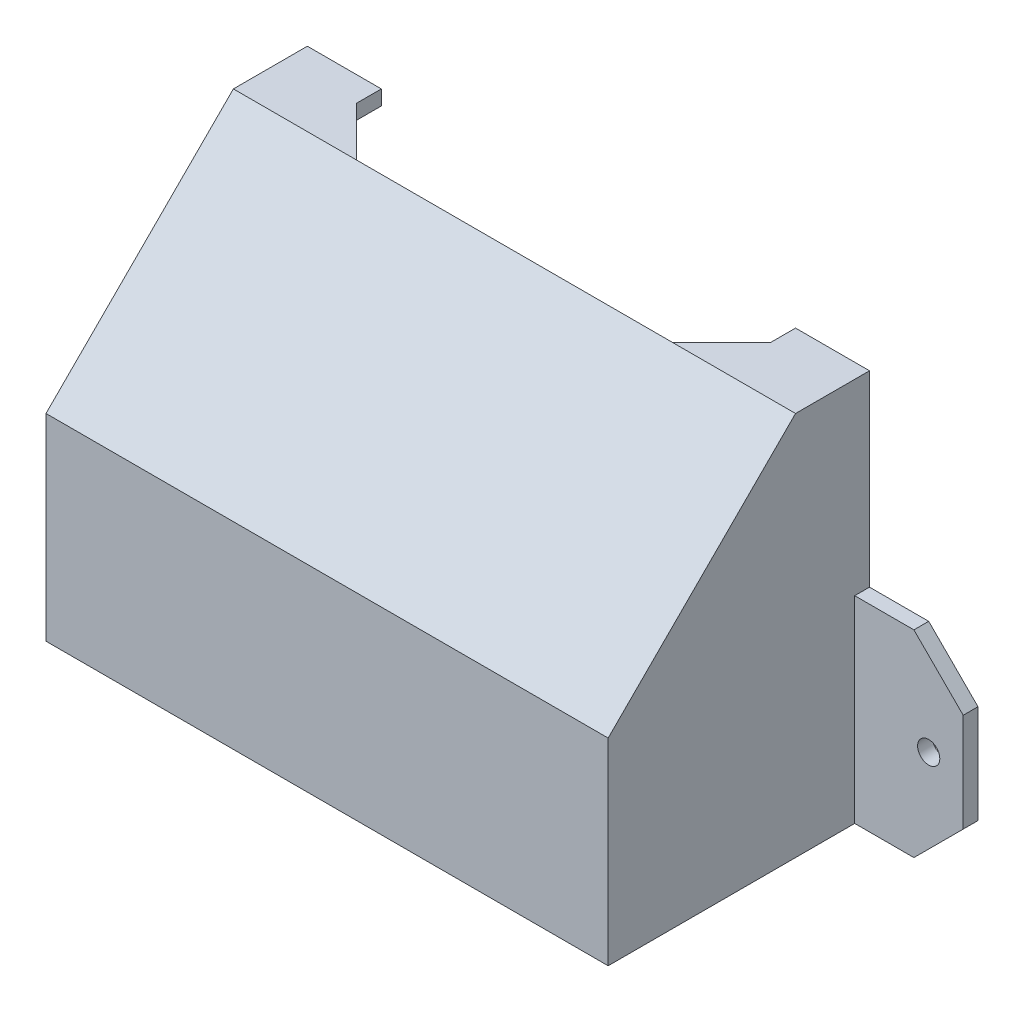
ISO-10303-21;
HEADER;
FILE_DESCRIPTION(('STEP AP214'),'2;1');
FILE_NAME('part.step','',(''),(''),'','','');
FILE_SCHEMA(('AUTOMOTIVE_DESIGN { 1 0 10303 214 1 1 1 1 }'));
ENDSEC;
DATA;
#1=APPLICATION_CONTEXT('core data for automotive mechanical design processes');
#2=APPLICATION_PROTOCOL_DEFINITION('international standard','automotive_design',2000,#1);
#3=PRODUCT_CONTEXT('',#1,'mechanical');
#4=PRODUCT('Part','Part','',(#3));
#5=PRODUCT_RELATED_PRODUCT_CATEGORY('part','',(#4));
#6=PRODUCT_DEFINITION_FORMATION('','',#4);
#7=PRODUCT_DEFINITION_CONTEXT('part definition',#1,'design');
#8=PRODUCT_DEFINITION('design','',#6,#7);
#9=PRODUCT_DEFINITION_SHAPE('','',#8);
#10=(LENGTH_UNIT() NAMED_UNIT(*) SI_UNIT(.MILLI.,.METRE.));
#11=(NAMED_UNIT(*) PLANE_ANGLE_UNIT() SI_UNIT($,.RADIAN.));
#12=(NAMED_UNIT(*) SI_UNIT($,.STERADIAN.) SOLID_ANGLE_UNIT());
#13=UNCERTAINTY_MEASURE_WITH_UNIT(LENGTH_MEASURE(1.E-05),#10,'distance_accuracy_value','');
#14=(GEOMETRIC_REPRESENTATION_CONTEXT(3) GLOBAL_UNCERTAINTY_ASSIGNED_CONTEXT((#13)) GLOBAL_UNIT_ASSIGNED_CONTEXT((#10,
#11,#12)) REPRESENTATION_CONTEXT('',''));
#15=CARTESIAN_POINT('',(0.,0.,0.));
#16=DIRECTION('',(0.,0.,1.));
#17=DIRECTION('',(1.,0.,0.));
#18=AXIS2_PLACEMENT_3D('',#15,#16,#17);
#19=CARTESIAN_POINT('',(57.0000000000004,40.,0.));
#20=DIRECTION('',(0.,0.,1.));
#21=DIRECTION('',(1.,0.,0.));
#22=AXIS2_PLACEMENT_3D('',#19,#20,#21);
#23=PLANE('',#22);
#24=CARTESIAN_POINT('',(72.,19.9999999999999,0.));
#25=DIRECTION('',(0.,0.,-1.));
#26=DIRECTION('',(-1.,0.,0.));
#27=AXIS2_PLACEMENT_3D('',#24,#25,#26);
#28=CIRCLE('',#27,2.25);
#29=CARTESIAN_POINT('',(69.75,19.9999999999999,0.));
#30=VERTEX_POINT('',#29);
#31=EDGE_CURVE('E756',#30,#30,#28,.T.);
#32=ORIENTED_EDGE('',*,*,#31,.F.);
#33=EDGE_LOOP('',(#32));
#34=FACE_BOUND('',#33,.T.);
#35=DIRECTION('',(0.,-1.,0.));
#36=VECTOR('',#35,1.);
#37=CARTESIAN_POINT('',(79.0000000000001,40.,0.));
#38=LINE('',#37,#36);
#39=CARTESIAN_POINT('',(79.0000000000001,29.9999999999999,0.));
#40=VERTEX_POINT('',#39);
#41=CARTESIAN_POINT('',(79.0000000000001,9.99999999999998,0.));
#42=VERTEX_POINT('',#41);
#43=EDGE_CURVE('E344',#40,#42,#38,.T.);
#44=ORIENTED_EDGE('',*,*,#43,.T.);
#45=DIRECTION('',(-0.70710678118655,-0.707106781186546,0.));
#46=VECTOR('',#45,1.);
#47=CARTESIAN_POINT('',(79.0000000000001,9.99999999999998,0.));
#48=LINE('',#47,#46);
#49=CARTESIAN_POINT('',(69.,0.,0.));
#50=VERTEX_POINT('',#49);
#51=EDGE_CURVE('E265',#42,#50,#48,.T.);
#52=ORIENTED_EDGE('',*,*,#51,.T.);
#53=DIRECTION('',(-1.,0.,0.));
#54=VECTOR('',#53,1.);
#55=CARTESIAN_POINT('',(57.0000000000004,0.,0.));
#56=LINE('',#55,#54);
#57=CARTESIAN_POINT('',(54.0000000000003,0.,0.));
#58=VERTEX_POINT('',#57);
#59=EDGE_CURVE('E322',#50,#58,#56,.T.);
#60=ORIENTED_EDGE('',*,*,#59,.T.);
#61=DIRECTION('',(0.,-1.,0.));
#62=VECTOR('',#61,1.);
#63=CARTESIAN_POINT('',(54.0000000000003,40.,0.));
#64=LINE('',#63,#62);
#65=CARTESIAN_POINT('',(54.0000000000003,74.9999999999996,0.));
#66=VERTEX_POINT('',#65);
#67=EDGE_CURVE('E341',#66,#58,#64,.T.);
#68=ORIENTED_EDGE('',*,*,#67,.F.);
#69=DIRECTION('',(1.,0.,0.));
#70=VECTOR('',#69,1.);
#71=CARTESIAN_POINT('',(-500000.,74.9999999999996,-3.26163235309096E-09));
#72=LINE('',#71,#70);
#73=CARTESIAN_POINT('',(41.9999999998595,74.9999999999996,0.));
#74=VERTEX_POINT('',#73);
#75=EDGE_CURVE('E223',#74,#66,#72,.T.);
#76=ORIENTED_EDGE('',*,*,#75,.F.);
#77=DIRECTION('',(0.,-1.,0.));
#78=VECTOR('',#77,1.);
#79=CARTESIAN_POINT('',(42.,311.753396714048,0.));
#80=LINE('',#79,#78);
#81=CARTESIAN_POINT('',(42.,77.9999999999996,0.));
#82=VERTEX_POINT('',#81);
#83=EDGE_CURVE('E464',#82,#74,#80,.T.);
#84=ORIENTED_EDGE('',*,*,#83,.F.);
#85=DIRECTION('',(-1.,0.,0.));
#86=VECTOR('',#85,1.);
#87=CARTESIAN_POINT('',(-54.,77.9999999999996,0.));
#88=LINE('',#87,#86);
#89=CARTESIAN_POINT('',(57.,77.9999999999996,0.));
#90=VERTEX_POINT('',#89);
#91=EDGE_CURVE('E312',#90,#82,#88,.T.);
#92=ORIENTED_EDGE('',*,*,#91,.F.);
#93=DIRECTION('',(0.,-1.,0.));
#94=VECTOR('',#93,1.);
#95=CARTESIAN_POINT('',(57.,77.9999999999996,0.));
#96=LINE('',#95,#94);
#97=CARTESIAN_POINT('',(57.,40.,0.));
#98=VERTEX_POINT('',#97);
#99=EDGE_CURVE('E387',#90,#98,#96,.T.);
#100=ORIENTED_EDGE('',*,*,#99,.T.);
#101=DIRECTION('',(-1.,0.,0.));
#102=VECTOR('',#101,1.);
#103=CARTESIAN_POINT('',(57.0000000000004,40.,0.));
#104=LINE('',#103,#102);
#105=CARTESIAN_POINT('',(69.,40.,0.));
#106=VERTEX_POINT('',#105);
#107=EDGE_CURVE('E337',#106,#98,#104,.T.);
#108=ORIENTED_EDGE('',*,*,#107,.F.);
#109=DIRECTION('',(-0.707106781186546,0.707106781186549,0.));
#110=VECTOR('',#109,1.);
#111=CARTESIAN_POINT('',(69.,40.,0.));
#112=LINE('',#111,#110);
#113=EDGE_CURVE('E263',#106,#40,#112,.F.);
#114=ORIENTED_EDGE('',*,*,#113,.T.);
#115=EDGE_LOOP('',(#44,#52,#60,#68,#76,#84,#92,#100,#108,#114));
#116=FACE_BOUND('',#115,.T.);
#117=ADVANCED_FACE('F33',(#34,#116),#23,.F.);
#118=CARTESIAN_POINT('',(-72.,19.9999999999999,0.));
#119=DIRECTION('',(0.,0.,1.));
#120=DIRECTION('',(1.,0.,0.));
#121=AXIS2_PLACEMENT_3D('',#118,#119,#120);
#122=CIRCLE('',#121,2.25);
#123=CARTESIAN_POINT('',(-69.75,19.9999999999999,0.));
#124=VERTEX_POINT('',#123);
#125=EDGE_CURVE('E235',#124,#124,#122,.T.);
#126=ORIENTED_EDGE('',*,*,#125,.T.);
#127=EDGE_LOOP('',(#126));
#128=FACE_BOUND('',#127,.T.);
#129=DIRECTION('',(-1.,0.,0.));
#130=VECTOR('',#129,1.);
#131=CARTESIAN_POINT('',(-57.0000000000004,0.,0.));
#132=LINE('',#131,#130);
#133=CARTESIAN_POINT('',(-54.0000000000003,0.,0.));
#134=VERTEX_POINT('',#133);
#135=CARTESIAN_POINT('',(-69.,0.,0.));
#136=VERTEX_POINT('',#135);
#137=EDGE_CURVE('E288',#134,#136,#132,.T.);
#138=ORIENTED_EDGE('',*,*,#137,.T.);
#139=DIRECTION('',(-0.70710678118655,0.707106781186546,0.));
#140=VECTOR('',#139,1.);
#141=CARTESIAN_POINT('',(-79.,9.99999999999998,0.));
#142=LINE('',#141,#140);
#143=CARTESIAN_POINT('',(-79.,9.99999999999998,0.));
#144=VERTEX_POINT('',#143);
#145=EDGE_CURVE('E41',#136,#144,#142,.T.);
#146=ORIENTED_EDGE('',*,*,#145,.T.);
#147=DIRECTION('',(0.,-1.,0.));
#148=VECTOR('',#147,1.);
#149=CARTESIAN_POINT('',(-79.,40.,0.));
#150=LINE('',#149,#148);
#151=CARTESIAN_POINT('',(-79.,29.9999999999999,0.));
#152=VERTEX_POINT('',#151);
#153=EDGE_CURVE('E241',#152,#144,#150,.T.);
#154=ORIENTED_EDGE('',*,*,#153,.F.);
#155=DIRECTION('',(-0.707106781186546,-0.707106781186549,0.));
#156=VECTOR('',#155,1.);
#157=CARTESIAN_POINT('',(-69.,40.,0.));
#158=LINE('',#157,#156);
#159=CARTESIAN_POINT('',(-69.,40.,0.));
#160=VERTEX_POINT('',#159);
#161=EDGE_CURVE('E48',#152,#160,#158,.F.);
#162=ORIENTED_EDGE('',*,*,#161,.T.);
#163=DIRECTION('',(-1.,0.,0.));
#164=VECTOR('',#163,1.);
#165=CARTESIAN_POINT('',(-57.0000000000004,40.,0.));
#166=LINE('',#165,#164);
#167=CARTESIAN_POINT('',(-57.,40.,0.));
#168=VERTEX_POINT('',#167);
#169=EDGE_CURVE('E333',#168,#160,#166,.T.);
#170=ORIENTED_EDGE('',*,*,#169,.F.);
#171=DIRECTION('',(0.,-1.,0.));
#172=VECTOR('',#171,1.);
#173=CARTESIAN_POINT('',(-57.,77.9999999999996,0.));
#174=LINE('',#173,#172);
#175=CARTESIAN_POINT('',(-57.,77.9999999999996,0.));
#176=VERTEX_POINT('',#175);
#177=EDGE_CURVE('E415',#176,#168,#174,.T.);
#178=ORIENTED_EDGE('',*,*,#177,.F.);
#179=CARTESIAN_POINT('',(-42.,77.9999999999996,0.));
#180=VERTEX_POINT('',#179);
#181=EDGE_CURVE('E231',#180,#176,#88,.T.);
#182=ORIENTED_EDGE('',*,*,#181,.F.);
#183=DIRECTION('',(0.,-1.,0.));
#184=VECTOR('',#183,1.);
#185=CARTESIAN_POINT('',(-42.,311.753396714048,0.));
#186=LINE('',#185,#184);
#187=CARTESIAN_POINT('',(-42.,74.9999999999996,0.));
#188=VERTEX_POINT('',#187);
#189=EDGE_CURVE('E227',#180,#188,#186,.T.);
#190=ORIENTED_EDGE('',*,*,#189,.T.);
#191=CARTESIAN_POINT('',(-54.0000000000003,74.9999999999996,0.));
#192=VERTEX_POINT('',#191);
#193=EDGE_CURVE('E214',#192,#188,#72,.T.);
#194=ORIENTED_EDGE('',*,*,#193,.F.);
#195=DIRECTION('',(0.,-1.,0.));
#196=VECTOR('',#195,1.);
#197=CARTESIAN_POINT('',(-54.0000000000003,40.,0.));
#198=LINE('',#197,#196);
#199=EDGE_CURVE('E334',#192,#134,#198,.T.);
#200=ORIENTED_EDGE('',*,*,#199,.T.);
#201=EDGE_LOOP('',(#138,#146,#154,#162,#170,#178,#182,#190,#194,#200));
#202=FACE_BOUND('',#201,.T.);
#203=ADVANCED_FACE('F229',(#128,#202),#23,.F.);
#204=CARTESIAN_POINT('',(-54.,77.9999999999996,15.));
#205=DIRECTION('',(0.,1.,0.));
#206=DIRECTION('',(0.,0.,1.));
#207=AXIS2_PLACEMENT_3D('',#204,#205,#206);
#208=PLANE('',#207);
#209=ORIENTED_EDGE('',*,*,#91,.T.);
#210=DIRECTION('',(0.,0.,-1.));
#211=VECTOR('',#210,1.);
#212=CARTESIAN_POINT('',(42.,77.9999999999996,4.99999999999999));
#213=LINE('',#212,#211);
#214=CARTESIAN_POINT('',(42.,77.9999999999996,4.99999999999998));
#215=VERTEX_POINT('',#214);
#216=EDGE_CURVE('E439',#215,#82,#213,.T.);
#217=ORIENTED_EDGE('',*,*,#216,.F.);
#218=DIRECTION('',(0.707106781186548,0.,-0.707106781186548));
#219=VECTOR('',#218,1.);
#220=CARTESIAN_POINT('',(32.,77.9999999999996,15.));
#221=LINE('',#220,#219);
#222=CARTESIAN_POINT('',(32.,77.9999999999996,15.));
#223=VERTEX_POINT('',#222);
#224=EDGE_CURVE('E438',#223,#215,#221,.T.);
#225=ORIENTED_EDGE('',*,*,#224,.F.);
#226=DIRECTION('',(-1.,0.,0.));
#227=VECTOR('',#226,1.);
#228=CARTESIAN_POINT('',(-54.,77.9999999999996,15.));
#229=LINE('',#228,#227);
#230=CARTESIAN_POINT('',(57.,77.9999999999996,15.));
#231=VERTEX_POINT('',#230);
#232=EDGE_CURVE('E418',#231,#223,#229,.T.);
#233=ORIENTED_EDGE('',*,*,#232,.F.);
#234=DIRECTION('',(0.,0.,-1.));
#235=VECTOR('',#234,1.);
#236=CARTESIAN_POINT('',(57.,77.9999999999996,15.));
#237=LINE('',#236,#235);
#238=EDGE_CURVE('E392',#231,#90,#237,.T.);
#239=ORIENTED_EDGE('',*,*,#238,.T.);
#240=EDGE_LOOP('',(#209,#217,#225,#233,#239));
#241=FACE_BOUND('',#240,.T.);
#242=ADVANCED_FACE('F435',(#241),#208,.T.);
#243=CARTESIAN_POINT('',(-32.,77.9999999999996,15.));
#244=VERTEX_POINT('',#243);
#245=CARTESIAN_POINT('',(-57.,77.9999999999996,15.));
#246=VERTEX_POINT('',#245);
#247=EDGE_CURVE('E417',#244,#246,#229,.T.);
#248=ORIENTED_EDGE('',*,*,#247,.F.);
#249=DIRECTION('',(0.707106781186548,0.,0.707106781186547));
#250=VECTOR('',#249,1.);
#251=CARTESIAN_POINT('',(-42.,77.9999999999996,5.));
#252=LINE('',#251,#250);
#253=CARTESIAN_POINT('',(-42.,77.9999999999996,5.));
#254=VERTEX_POINT('',#253);
#255=EDGE_CURVE('E445',#254,#244,#252,.T.);
#256=ORIENTED_EDGE('',*,*,#255,.F.);
#257=DIRECTION('',(0.,0.,1.));
#258=VECTOR('',#257,1.);
#259=CARTESIAN_POINT('',(-42.,77.9999999999996,0.));
#260=LINE('',#259,#258);
#261=EDGE_CURVE('E454',#180,#254,#260,.T.);
#262=ORIENTED_EDGE('',*,*,#261,.F.);
#263=ORIENTED_EDGE('',*,*,#181,.T.);
#264=DIRECTION('',(0.,0.,-1.));
#265=VECTOR('',#264,1.);
#266=CARTESIAN_POINT('',(-57.,77.9999999999996,15.));
#267=LINE('',#266,#265);
#268=EDGE_CURVE('E412',#246,#176,#267,.T.);
#269=ORIENTED_EDGE('',*,*,#268,.F.);
#270=EDGE_LOOP('',(#248,#256,#262,#263,#269));
#271=FACE_BOUND('',#270,.T.);
#272=ADVANCED_FACE('F428',(#271),#208,.T.);
#273=CARTESIAN_POINT('',(-500000.,75.8786796564399,12.8786796531787));
#274=DIRECTION('',(0.,0.707106781186552,0.707106781186543));
#275=DIRECTION('',(0.,-0.707106781186543,0.707106781186552));
#276=AXIS2_PLACEMENT_3D('',#273,#274,#275);
#277=PLANE('',#276);
#278=DIRECTION('',(-0.577350269189627,-0.577350269189623,0.577350269189627));
#279=VECTOR('',#278,1.);
#280=CARTESIAN_POINT('',(-166643.919119771,-166602.161760457,166690.919119771));
#281=LINE('',#280,#279);
#282=CARTESIAN_POINT('',(33.2426406870354,74.9999999999996,13.7573593128927));
#283=VERTEX_POINT('',#282);
#284=CARTESIAN_POINT('',(32.0000000000391,73.7573593128802,15.));
#285=VERTEX_POINT('',#284);
#286=EDGE_CURVE('E470',#283,#285,#281,.T.);
#287=ORIENTED_EDGE('',*,*,#286,.F.);
#288=DIRECTION('',(1.,0.,0.));
#289=VECTOR('',#288,1.);
#290=CARTESIAN_POINT('',(-500000.,74.9999999999996,13.7573593096191));
#291=LINE('',#290,#289);
#292=CARTESIAN_POINT('',(54.0000000000002,74.9999999999996,13.7573593128807));
#293=VERTEX_POINT('',#292);
#294=EDGE_CURVE('E222',#283,#293,#291,.T.);
#295=ORIENTED_EDGE('',*,*,#294,.T.);
#296=DIRECTION('',(0.,-0.707106781186543,0.707106781186552));
#297=VECTOR('',#296,1.);
#298=CARTESIAN_POINT('',(54.0000000000002,75.8786796564399,12.8786796564404));
#299=LINE('',#298,#297);
#300=CARTESIAN_POINT('',(54.,38.7573593128807,50.));
#301=VERTEX_POINT('',#300);
#302=EDGE_CURVE('E396',#293,#301,#299,.T.);
#303=ORIENTED_EDGE('',*,*,#302,.T.);
#304=DIRECTION('',(1.,0.,0.));
#305=VECTOR('',#304,1.);
#306=CARTESIAN_POINT('',(-500000.,38.757359309844,49.9999999997752));
#307=LINE('',#306,#305);
#308=CARTESIAN_POINT('',(-54.,38.7573593128801,50.));
#309=VERTEX_POINT('',#308);
#310=EDGE_CURVE('E478',#309,#301,#307,.T.);
#311=ORIENTED_EDGE('',*,*,#310,.F.);
#312=DIRECTION('',(0.,-0.707106781186543,0.707106781186552));
#313=VECTOR('',#312,1.);
#314=CARTESIAN_POINT('',(-53.9999999999736,75.8786796594927,12.8786796533869));
#315=LINE('',#314,#313);
#316=CARTESIAN_POINT('',(-54.0000000000002,74.9999999999996,13.7573593128807));
#317=VERTEX_POINT('',#316);
#318=EDGE_CURVE('E479',#317,#309,#315,.T.);
#319=ORIENTED_EDGE('',*,*,#318,.F.);
#320=CARTESIAN_POINT('',(-33.2426406870781,74.9999999999996,13.7573593129209));
#321=VERTEX_POINT('',#320);
#322=EDGE_CURVE('E474',#317,#321,#291,.T.);
#323=ORIENTED_EDGE('',*,*,#322,.T.);
#324=DIRECTION('',(-0.57735026918963,0.577350269189618,-0.57735026918963));
#325=VECTOR('',#324,1.);
#326=CARTESIAN_POINT('',(-166689.414213566,166731.171572875,-166642.414213566));
#327=LINE('',#326,#325);
#328=CARTESIAN_POINT('',(-32.0000000000107,73.7573593128502,15.0000000000148));
#329=VERTEX_POINT('',#328);
#330=EDGE_CURVE('E455',#329,#321,#327,.T.);
#331=ORIENTED_EDGE('',*,*,#330,.F.);
#332=DIRECTION('',(-1.,0.,0.));
#333=VECTOR('',#332,1.);
#334=CARTESIAN_POINT('',(-500000.,73.7573593095645,15.0000000000542));
#335=LINE('',#334,#333);
#336=EDGE_CURVE('E255',#285,#329,#335,.T.);
#337=ORIENTED_EDGE('',*,*,#336,.F.);
#338=EDGE_LOOP('',(#287,#295,#303,#311,#319,#323,#331,#337));
#339=FACE_BOUND('',#338,.T.);
#340=ADVANCED_FACE('F486',(#339),#277,.F.);
#341=CARTESIAN_POINT('',(-500000.,74.9999999999996,-3.26163235309096E-09));
#342=DIRECTION('',(0.,1.,0.));
#343=DIRECTION('',(0.,0.,1.));
#344=AXIS2_PLACEMENT_3D('',#341,#342,#343);
#345=PLANE('',#344);
#346=DIRECTION('',(0.,0.,1.));
#347=VECTOR('',#346,1.);
#348=CARTESIAN_POINT('',(41.9999999999732,74.9999999999996,-3.26163235309096E-09));
#349=LINE('',#348,#347);
#350=CARTESIAN_POINT('',(42.0000000000016,74.9999999999996,4.99999999999545));
#351=VERTEX_POINT('',#350);
#352=EDGE_CURVE('E252',#74,#351,#349,.T.);
#353=ORIENTED_EDGE('',*,*,#352,.F.);
#354=ORIENTED_EDGE('',*,*,#75,.T.);
#355=DIRECTION('',(0.,0.,1.));
#356=VECTOR('',#355,1.);
#357=CARTESIAN_POINT('',(54.0000000000003,74.9999999999996,0.));
#358=LINE('',#357,#356);
#359=EDGE_CURVE('E399',#66,#293,#358,.T.);
#360=ORIENTED_EDGE('',*,*,#359,.T.);
#361=ORIENTED_EDGE('',*,*,#294,.F.);
#362=DIRECTION('',(-0.707106781186548,0.,0.707106781186548));
#363=VECTOR('',#362,1.);
#364=CARTESIAN_POINT('',(-249976.499999998,74.9999999999996,250023.499999998));
#365=LINE('',#364,#363);
#366=EDGE_CURVE('E243',#351,#283,#365,.T.);
#367=ORIENTED_EDGE('',*,*,#366,.F.);
#368=EDGE_LOOP('',(#353,#354,#360,#361,#367));
#369=FACE_BOUND('',#368,.T.);
#370=ADVANCED_FACE('F496',(#369),#345,.F.);
#371=DIRECTION('',(-0.707106781186548,0.,-0.707106781186547));
#372=VECTOR('',#371,1.);
#373=CARTESIAN_POINT('',(-250023.500000002,74.9999999999996,-249976.500000002));
#374=LINE('',#373,#372);
#375=CARTESIAN_POINT('',(-41.9999999999732,74.9999999999996,5.));
#376=VERTEX_POINT('',#375);
#377=EDGE_CURVE('E240',#321,#376,#374,.T.);
#378=ORIENTED_EDGE('',*,*,#377,.F.);
#379=ORIENTED_EDGE('',*,*,#322,.F.);
#380=DIRECTION('',(0.,0.,1.));
#381=VECTOR('',#380,1.);
#382=CARTESIAN_POINT('',(-53.9999999999736,74.9999999999996,-6.10627159947086E-09));
#383=LINE('',#382,#381);
#384=EDGE_CURVE('E221',#192,#317,#383,.T.);
#385=ORIENTED_EDGE('',*,*,#384,.F.);
#386=ORIENTED_EDGE('',*,*,#193,.T.);
#387=DIRECTION('',(0.,0.,-1.));
#388=VECTOR('',#387,1.);
#389=CARTESIAN_POINT('',(-41.9999999999732,74.9999999999996,-3.26163235309096E-09));
#390=LINE('',#389,#388);
#391=EDGE_CURVE('E218',#376,#188,#390,.T.);
#392=ORIENTED_EDGE('',*,*,#391,.F.);
#393=EDGE_LOOP('',(#378,#379,#385,#386,#392));
#394=FACE_BOUND('',#393,.T.);
#395=ADVANCED_FACE('F216',(#394),#345,.F.);
#396=CARTESIAN_POINT('',(54.0000000000003,40.,0.));
#397=DIRECTION('',(1.,0.,0.));
#398=DIRECTION('',(0.,0.,-1.));
#399=AXIS2_PLACEMENT_3D('',#396,#397,#398);
#400=PLANE('',#399);
#401=ORIENTED_EDGE('',*,*,#302,.F.);
#402=ORIENTED_EDGE('',*,*,#359,.F.);
#403=ORIENTED_EDGE('',*,*,#67,.T.);
#404=DIRECTION('',(0.,0.,1.));
#405=VECTOR('',#404,1.);
#406=CARTESIAN_POINT('',(54.0000000000003,0.,0.));
#407=LINE('',#406,#405);
#408=CARTESIAN_POINT('',(54.,0.,50.));
#409=VERTEX_POINT('',#408);
#410=EDGE_CURVE('E324',#58,#409,#407,.T.);
#411=ORIENTED_EDGE('',*,*,#410,.T.);
#412=DIRECTION('',(0.,-1.,0.));
#413=VECTOR('',#412,1.);
#414=CARTESIAN_POINT('',(54.,40.,50.));
#415=LINE('',#414,#413);
#416=EDGE_CURVE('E339',#301,#409,#415,.T.);
#417=ORIENTED_EDGE('',*,*,#416,.F.);
#418=EDGE_LOOP('',(#401,#402,#403,#411,#417));
#419=FACE_BOUND('',#418,.T.);
#420=ADVANCED_FACE('F501',(#419),#400,.F.);
#421=CARTESIAN_POINT('',(-54.,40.,50.));
#422=DIRECTION('',(0.,0.,1.));
#423=DIRECTION('',(1.,0.,0.));
#424=AXIS2_PLACEMENT_3D('',#421,#422,#423);
#425=PLANE('',#424);
#426=ORIENTED_EDGE('',*,*,#310,.T.);
#427=ORIENTED_EDGE('',*,*,#416,.T.);
#428=DIRECTION('',(-1.,0.,0.));
#429=VECTOR('',#428,1.);
#430=CARTESIAN_POINT('',(-54.,0.,50.));
#431=LINE('',#430,#429);
#432=CARTESIAN_POINT('',(-54.,0.,50.));
#433=VERTEX_POINT('',#432);
#434=EDGE_CURVE('E327',#409,#433,#431,.T.);
#435=ORIENTED_EDGE('',*,*,#434,.T.);
#436=DIRECTION('',(0.,-1.,0.));
#437=VECTOR('',#436,1.);
#438=CARTESIAN_POINT('',(-54.,40.,50.));
#439=LINE('',#438,#437);
#440=EDGE_CURVE('E336',#309,#433,#439,.T.);
#441=ORIENTED_EDGE('',*,*,#440,.F.);
#442=EDGE_LOOP('',(#426,#427,#435,#441));
#443=FACE_BOUND('',#442,.T.);
#444=ADVANCED_FACE('F569',(#443),#425,.F.);
#445=CARTESIAN_POINT('',(-54.0000000000003,40.,0.));
#446=DIRECTION('',(-1.,0.,0.));
#447=DIRECTION('',(0.,0.,1.));
#448=AXIS2_PLACEMENT_3D('',#445,#446,#447);
#449=PLANE('',#448);
#450=ORIENTED_EDGE('',*,*,#318,.T.);
#451=ORIENTED_EDGE('',*,*,#440,.T.);
#452=DIRECTION('',(0.,0.,-1.));
#453=VECTOR('',#452,1.);
#454=CARTESIAN_POINT('',(-54.0000000000003,0.,0.));
#455=LINE('',#454,#453);
#456=EDGE_CURVE('E330',#433,#134,#455,.T.);
#457=ORIENTED_EDGE('',*,*,#456,.T.);
#458=ORIENTED_EDGE('',*,*,#199,.F.);
#459=ORIENTED_EDGE('',*,*,#384,.T.);
#460=EDGE_LOOP('',(#450,#451,#457,#458,#459));
#461=FACE_BOUND('',#460,.T.);
#462=ADVANCED_FACE('F483',(#461),#449,.F.);
#463=CARTESIAN_POINT('',(0.,40.,0.));
#464=DIRECTION('',(0.,-1.,0.));
#465=DIRECTION('',(0.,0.,-1.));
#466=AXIS2_PLACEMENT_3D('',#463,#464,#465);
#467=PLANE('',#466);
#468=DIRECTION('',(1.,0.,0.));
#469=VECTOR('',#468,1.);
#470=CARTESIAN_POINT('',(79.0000000000001,40.,3.00000000000007));
#471=LINE('',#470,#469);
#472=CARTESIAN_POINT('',(57.0000000000001,40.,3.00000000000006));
#473=VERTEX_POINT('',#472);
#474=CARTESIAN_POINT('',(69.,40.,3.00000000000007));
#475=VERTEX_POINT('',#474);
#476=EDGE_CURVE('E371',#473,#475,#471,.T.);
#477=ORIENTED_EDGE('',*,*,#476,.T.);
#478=DIRECTION('',(0.,0.,-1.));
#479=VECTOR('',#478,1.);
#480=CARTESIAN_POINT('',(69.,40.,0.));
#481=LINE('',#480,#479);
#482=EDGE_CURVE('E275',#475,#106,#481,.T.);
#483=ORIENTED_EDGE('',*,*,#482,.T.);
#484=ORIENTED_EDGE('',*,*,#107,.T.);
#485=DIRECTION('',(0.,0.,1.));
#486=VECTOR('',#485,1.);
#487=CARTESIAN_POINT('',(57.,40.,0.));
#488=LINE('',#487,#486);
#489=EDGE_CURVE('E382',#98,#473,#488,.T.);
#490=ORIENTED_EDGE('',*,*,#489,.T.);
#491=EDGE_LOOP('',(#477,#483,#484,#490));
#492=FACE_BOUND('',#491,.T.);
#493=ADVANCED_FACE('F380',(#492),#467,.F.);
#494=ORIENTED_EDGE('',*,*,#169,.T.);
#495=DIRECTION('',(0.,0.,1.));
#496=VECTOR('',#495,1.);
#497=CARTESIAN_POINT('',(-69.,40.,0.));
#498=LINE('',#497,#496);
#499=CARTESIAN_POINT('',(-69.,40.,3.));
#500=VERTEX_POINT('',#499);
#501=EDGE_CURVE('E11',#160,#500,#498,.T.);
#502=ORIENTED_EDGE('',*,*,#501,.T.);
#503=DIRECTION('',(1.,0.,0.));
#504=VECTOR('',#503,1.);
#505=CARTESIAN_POINT('',(-79.,40.,3.));
#506=LINE('',#505,#504);
#507=CARTESIAN_POINT('',(-57.,40.,3.));
#508=VERTEX_POINT('',#507);
#509=EDGE_CURVE('E367',#500,#508,#506,.T.);
#510=ORIENTED_EDGE('',*,*,#509,.T.);
#511=DIRECTION('',(0.,0.,1.));
#512=VECTOR('',#511,1.);
#513=CARTESIAN_POINT('',(-57.,40.,0.));
#514=LINE('',#513,#512);
#515=EDGE_CURVE('E365',#168,#508,#514,.T.);
#516=ORIENTED_EDGE('',*,*,#515,.F.);
#517=EDGE_LOOP('',(#494,#502,#510,#516));
#518=FACE_BOUND('',#517,.T.);
#519=ADVANCED_FACE('F555',(#518),#467,.F.);
#520=CARTESIAN_POINT('',(-79.,40.,0.));
#521=DIRECTION('',(1.,0.,0.));
#522=DIRECTION('',(0.,0.,-1.));
#523=AXIS2_PLACEMENT_3D('',#520,#521,#522);
#524=PLANE('',#523);
#525=ORIENTED_EDGE('',*,*,#153,.T.);
#526=DIRECTION('',(0.,0.,1.));
#527=VECTOR('',#526,1.);
#528=CARTESIAN_POINT('',(-79.,9.99999999999998,3.));
#529=LINE('',#528,#527);
#530=CARTESIAN_POINT('',(-79.,9.99999999999998,3.));
#531=VERTEX_POINT('',#530);
#532=EDGE_CURVE('E280',#144,#531,#529,.T.);
#533=ORIENTED_EDGE('',*,*,#532,.T.);
#534=DIRECTION('',(0.,-1.,0.));
#535=VECTOR('',#534,1.);
#536=CARTESIAN_POINT('',(-79.,40.,3.));
#537=LINE('',#536,#535);
#538=CARTESIAN_POINT('',(-79.,29.9999999999999,3.));
#539=VERTEX_POINT('',#538);
#540=EDGE_CURVE('E246',#539,#531,#537,.T.);
#541=ORIENTED_EDGE('',*,*,#540,.F.);
#542=DIRECTION('',(0.,0.,-1.));
#543=VECTOR('',#542,1.);
#544=CARTESIAN_POINT('',(-79.,29.9999999999999,0.));
#545=LINE('',#544,#543);
#546=EDGE_CURVE('E278',#539,#152,#545,.T.);
#547=ORIENTED_EDGE('',*,*,#546,.T.);
#548=EDGE_LOOP('',(#525,#533,#541,#547));
#549=FACE_BOUND('',#548,.T.);
#550=ADVANCED_FACE('F293',(#549),#524,.F.);
#551=CARTESIAN_POINT('',(-79.,40.,3.));
#552=DIRECTION('',(0.,0.,-1.));
#553=DIRECTION('',(-1.,0.,0.));
#554=AXIS2_PLACEMENT_3D('',#551,#552,#553);
#555=PLANE('',#554);
#556=CARTESIAN_POINT('',(-72.,19.9999999999999,3.));
#557=DIRECTION('',(0.,0.,1.));
#558=DIRECTION('',(1.,0.,0.));
#559=AXIS2_PLACEMENT_3D('',#556,#557,#558);
#560=CIRCLE('',#559,2.25);
#561=CARTESIAN_POINT('',(-69.75,19.9999999999999,3.));
#562=VERTEX_POINT('',#561);
#563=EDGE_CURVE('E450',#562,#562,#560,.T.);
#564=ORIENTED_EDGE('',*,*,#563,.F.);
#565=EDGE_LOOP('',(#564));
#566=FACE_BOUND('',#565,.T.);
#567=ORIENTED_EDGE('',*,*,#540,.T.);
#568=DIRECTION('',(0.70710678118655,-0.707106781186546,0.));
#569=VECTOR('',#568,1.);
#570=CARTESIAN_POINT('',(-79.,9.99999999999998,3.));
#571=LINE('',#570,#569);
#572=CARTESIAN_POINT('',(-69.,0.,3.));
#573=VERTEX_POINT('',#572);
#574=EDGE_CURVE('E284',#531,#573,#571,.T.);
#575=ORIENTED_EDGE('',*,*,#574,.T.);
#576=DIRECTION('',(1.,0.,0.));
#577=VECTOR('',#576,1.);
#578=CARTESIAN_POINT('',(-79.,0.,3.));
#579=LINE('',#578,#577);
#580=CARTESIAN_POINT('',(-57.,0.,3.));
#581=VERTEX_POINT('',#580);
#582=EDGE_CURVE('E301',#573,#581,#579,.T.);
#583=ORIENTED_EDGE('',*,*,#582,.T.);
#584=DIRECTION('',(0.,-1.,0.));
#585=VECTOR('',#584,1.);
#586=CARTESIAN_POINT('',(-57.,40.,3.));
#587=LINE('',#586,#585);
#588=EDGE_CURVE('E359',#508,#581,#587,.T.);
#589=ORIENTED_EDGE('',*,*,#588,.F.);
#590=ORIENTED_EDGE('',*,*,#509,.F.);
#591=DIRECTION('',(0.707106781186546,0.707106781186549,0.));
#592=VECTOR('',#591,1.);
#593=CARTESIAN_POINT('',(-69.,40.,3.));
#594=LINE('',#593,#592);
#595=EDGE_CURVE('E56',#500,#539,#594,.F.);
#596=ORIENTED_EDGE('',*,*,#595,.T.);
#597=EDGE_LOOP('',(#567,#575,#583,#589,#590,#596));
#598=FACE_BOUND('',#597,.T.);
#599=ADVANCED_FACE('F299',(#566,#598),#555,.F.);
#600=CARTESIAN_POINT('',(-57.,40.,53.));
#601=DIRECTION('',(1.,0.,0.));
#602=DIRECTION('',(0.,0.,-1.));
#603=AXIS2_PLACEMENT_3D('',#600,#601,#602);
#604=PLANE('',#603);
#605=DIRECTION('',(0.,0.,1.));
#606=VECTOR('',#605,1.);
#607=CARTESIAN_POINT('',(-57.,0.,53.));
#608=LINE('',#607,#606);
#609=CARTESIAN_POINT('',(-57.,0.,53.));
#610=VERTEX_POINT('',#609);
#611=EDGE_CURVE('E308',#581,#610,#608,.T.);
#612=ORIENTED_EDGE('',*,*,#611,.T.);
#613=DIRECTION('',(0.,-1.,0.));
#614=VECTOR('',#613,1.);
#615=CARTESIAN_POINT('',(-57.,40.,53.));
#616=LINE('',#615,#614);
#617=CARTESIAN_POINT('',(-57.,40.,53.));
#618=VERTEX_POINT('',#617);
#619=EDGE_CURVE('E356',#618,#610,#616,.T.);
#620=ORIENTED_EDGE('',*,*,#619,.F.);
#621=DIRECTION('',(0.,0.707106781186543,-0.707106781186552));
#622=VECTOR('',#621,1.);
#623=CARTESIAN_POINT('',(-57.,40.,53.));
#624=LINE('',#623,#622);
#625=EDGE_CURVE('E409',#618,#246,#624,.T.);
#626=ORIENTED_EDGE('',*,*,#625,.T.);
#627=ORIENTED_EDGE('',*,*,#268,.T.);
#628=ORIENTED_EDGE('',*,*,#177,.T.);
#629=ORIENTED_EDGE('',*,*,#515,.T.);
#630=ORIENTED_EDGE('',*,*,#588,.T.);
#631=EDGE_LOOP('',(#612,#620,#626,#627,#628,#629,#630));
#632=FACE_BOUND('',#631,.T.);
#633=ADVANCED_FACE('F362',(#632),#604,.F.);
#634=CARTESIAN_POINT('',(57.,40.,53.0000000000001));
#635=DIRECTION('',(0.,0.,-1.));
#636=DIRECTION('',(-1.,0.,0.));
#637=AXIS2_PLACEMENT_3D('',#634,#635,#636);
#638=PLANE('',#637);
#639=DIRECTION('',(1.,0.,0.));
#640=VECTOR('',#639,1.);
#641=CARTESIAN_POINT('',(57.,0.,53.0000000000001));
#642=LINE('',#641,#640);
#643=CARTESIAN_POINT('',(57.,0.,53.0000000000001));
#644=VERTEX_POINT('',#643);
#645=EDGE_CURVE('E310',#610,#644,#642,.T.);
#646=ORIENTED_EDGE('',*,*,#645,.T.);
#647=DIRECTION('',(0.,-1.,0.));
#648=VECTOR('',#647,1.);
#649=CARTESIAN_POINT('',(57.,40.,53.0000000000001));
#650=LINE('',#649,#648);
#651=CARTESIAN_POINT('',(57.,40.,53.0000000000001));
#652=VERTEX_POINT('',#651);
#653=EDGE_CURVE('E353',#652,#644,#650,.T.);
#654=ORIENTED_EDGE('',*,*,#653,.F.);
#655=DIRECTION('',(1.,0.,0.));
#656=VECTOR('',#655,1.);
#657=CARTESIAN_POINT('',(57.,40.,53.0000000000001));
#658=LINE('',#657,#656);
#659=EDGE_CURVE('E369',#618,#652,#658,.T.);
#660=ORIENTED_EDGE('',*,*,#659,.F.);
#661=ORIENTED_EDGE('',*,*,#619,.T.);
#662=EDGE_LOOP('',(#646,#654,#660,#661));
#663=FACE_BOUND('',#662,.T.);
#664=ADVANCED_FACE('F432',(#663),#638,.F.);
#665=CARTESIAN_POINT('',(57.,40.,53.0000000000001));
#666=DIRECTION('',(-1.,0.,0.));
#667=DIRECTION('',(0.,0.,1.));
#668=AXIS2_PLACEMENT_3D('',#665,#666,#667);
#669=PLANE('',#668);
#670=DIRECTION('',(0.,0.,-1.));
#671=VECTOR('',#670,1.);
#672=CARTESIAN_POINT('',(57.,0.,53.0000000000001));
#673=LINE('',#672,#671);
#674=CARTESIAN_POINT('',(57.0000000000001,0.,3.00000000000006));
#675=VERTEX_POINT('',#674);
#676=EDGE_CURVE('E317',#644,#675,#673,.T.);
#677=ORIENTED_EDGE('',*,*,#676,.T.);
#678=DIRECTION('',(0.,-1.,0.));
#679=VECTOR('',#678,1.);
#680=CARTESIAN_POINT('',(57.0000000000001,40.,3.00000000000006));
#681=LINE('',#680,#679);
#682=EDGE_CURVE('E350',#473,#675,#681,.T.);
#683=ORIENTED_EDGE('',*,*,#682,.F.);
#684=ORIENTED_EDGE('',*,*,#489,.F.);
#685=ORIENTED_EDGE('',*,*,#99,.F.);
#686=ORIENTED_EDGE('',*,*,#238,.F.);
#687=DIRECTION('',(0.,0.707106781186543,-0.707106781186552));
#688=VECTOR('',#687,1.);
#689=CARTESIAN_POINT('',(57.,40.,53.));
#690=LINE('',#689,#688);
#691=EDGE_CURVE('E405',#652,#231,#690,.T.);
#692=ORIENTED_EDGE('',*,*,#691,.F.);
#693=ORIENTED_EDGE('',*,*,#653,.T.);
#694=EDGE_LOOP('',(#677,#683,#684,#685,#686,#692,#693));
#695=FACE_BOUND('',#694,.T.);
#696=ADVANCED_FACE('F394',(#695),#669,.F.);
#697=CARTESIAN_POINT('',(79.0000000000001,40.,3.00000000000007));
#698=DIRECTION('',(0.,0.,-1.));
#699=DIRECTION('',(-1.,0.,0.));
#700=AXIS2_PLACEMENT_3D('',#697,#698,#699);
#701=PLANE('',#700);
#702=CARTESIAN_POINT('',(72.,19.9999999999999,3.));
#703=DIRECTION('',(0.,0.,-1.));
#704=DIRECTION('',(-1.,0.,0.));
#705=AXIS2_PLACEMENT_3D('',#702,#703,#704);
#706=CIRCLE('',#705,2.25);
#707=CARTESIAN_POINT('',(69.75,19.9999999999999,3.));
#708=VERTEX_POINT('',#707);
#709=EDGE_CURVE('E759',#708,#708,#706,.T.);
#710=ORIENTED_EDGE('',*,*,#709,.T.);
#711=EDGE_LOOP('',(#710));
#712=FACE_BOUND('',#711,.T.);
#713=DIRECTION('',(1.,0.,0.));
#714=VECTOR('',#713,1.);
#715=CARTESIAN_POINT('',(79.0000000000001,0.,3.00000000000007));
#716=LINE('',#715,#714);
#717=CARTESIAN_POINT('',(69.,0.,3.00000000000007));
#718=VERTEX_POINT('',#717);
#719=EDGE_CURVE('E319',#675,#718,#716,.T.);
#720=ORIENTED_EDGE('',*,*,#719,.T.);
#721=DIRECTION('',(0.70710678118655,0.707106781186546,0.));
#722=VECTOR('',#721,1.);
#723=CARTESIAN_POINT('',(79.0000000000001,9.99999999999998,3.00000000000007));
#724=LINE('',#723,#722);
#725=CARTESIAN_POINT('',(79.0000000000001,9.99999999999998,3.00000000000007));
#726=VERTEX_POINT('',#725);
#727=EDGE_CURVE('E273',#718,#726,#724,.T.);
#728=ORIENTED_EDGE('',*,*,#727,.T.);
#729=DIRECTION('',(0.,-1.,0.));
#730=VECTOR('',#729,1.);
#731=CARTESIAN_POINT('',(79.0000000000001,40.,3.00000000000007));
#732=LINE('',#731,#730);
#733=CARTESIAN_POINT('',(79.0000000000001,29.9999999999999,3.00000000000007));
#734=VERTEX_POINT('',#733);
#735=EDGE_CURVE('E347',#734,#726,#732,.T.);
#736=ORIENTED_EDGE('',*,*,#735,.F.);
#737=DIRECTION('',(0.707106781186546,-0.707106781186549,0.));
#738=VECTOR('',#737,1.);
#739=CARTESIAN_POINT('',(69.,40.,3.00000000000007));
#740=LINE('',#739,#738);
#741=EDGE_CURVE('E271',#734,#475,#740,.F.);
#742=ORIENTED_EDGE('',*,*,#741,.T.);
#743=ORIENTED_EDGE('',*,*,#476,.F.);
#744=ORIENTED_EDGE('',*,*,#682,.T.);
#745=EDGE_LOOP('',(#720,#728,#736,#742,#743,#744));
#746=FACE_BOUND('',#745,.T.);
#747=ADVANCED_FACE('F513',(#712,#746),#701,.F.);
#748=CARTESIAN_POINT('',(79.0000000000001,40.,0.));
#749=DIRECTION('',(-1.,0.,0.));
#750=DIRECTION('',(0.,0.,1.));
#751=AXIS2_PLACEMENT_3D('',#748,#749,#750);
#752=PLANE('',#751);
#753=ORIENTED_EDGE('',*,*,#735,.T.);
#754=DIRECTION('',(0.,0.,-1.));
#755=VECTOR('',#754,1.);
#756=CARTESIAN_POINT('',(79.0000000000001,9.99999999999998,0.));
#757=LINE('',#756,#755);
#758=EDGE_CURVE('E260',#726,#42,#757,.T.);
#759=ORIENTED_EDGE('',*,*,#758,.T.);
#760=ORIENTED_EDGE('',*,*,#43,.F.);
#761=DIRECTION('',(0.,0.,1.));
#762=VECTOR('',#761,1.);
#763=CARTESIAN_POINT('',(79.0000000000001,29.9999999999999,0.));
#764=LINE('',#763,#762);
#765=EDGE_CURVE('E258',#40,#734,#764,.T.);
#766=ORIENTED_EDGE('',*,*,#765,.T.);
#767=EDGE_LOOP('',(#753,#759,#760,#766));
#768=FACE_BOUND('',#767,.T.);
#769=ADVANCED_FACE('F516',(#768),#752,.F.);
#770=CARTESIAN_POINT('',(0.,0.,0.));
#771=DIRECTION('',(0.,-1.,0.));
#772=DIRECTION('',(0.,0.,-1.));
#773=AXIS2_PLACEMENT_3D('',#770,#771,#772);
#774=PLANE('',#773);
#775=ORIENTED_EDGE('',*,*,#59,.F.);
#776=DIRECTION('',(0.,0.,1.));
#777=VECTOR('',#776,1.);
#778=CARTESIAN_POINT('',(69.,0.,3.00000000000007));
#779=LINE('',#778,#777);
#780=EDGE_CURVE('E269',#50,#718,#779,.T.);
#781=ORIENTED_EDGE('',*,*,#780,.T.);
#782=ORIENTED_EDGE('',*,*,#719,.F.);
#783=ORIENTED_EDGE('',*,*,#676,.F.);
#784=ORIENTED_EDGE('',*,*,#645,.F.);
#785=ORIENTED_EDGE('',*,*,#611,.F.);
#786=ORIENTED_EDGE('',*,*,#582,.F.);
#787=DIRECTION('',(0.,0.,-1.));
#788=VECTOR('',#787,1.);
#789=CARTESIAN_POINT('',(-69.,0.,0.));
#790=LINE('',#789,#788);
#791=EDGE_CURVE('E267',#573,#136,#790,.T.);
#792=ORIENTED_EDGE('',*,*,#791,.T.);
#793=ORIENTED_EDGE('',*,*,#137,.F.);
#794=ORIENTED_EDGE('',*,*,#456,.F.);
#795=ORIENTED_EDGE('',*,*,#434,.F.);
#796=ORIENTED_EDGE('',*,*,#410,.F.);
#797=EDGE_LOOP('',(#775,#781,#782,#783,#784,#785,#786,#792,#793,#794,#795,#796));
#798=FACE_BOUND('',#797,.T.);
#799=ADVANCED_FACE('F306',(#798),#774,.T.);
#800=CARTESIAN_POINT('',(-54.,40.,53.));
#801=DIRECTION('',(0.,0.707106781186552,0.707106781186543));
#802=DIRECTION('',(0.,-0.707106781186543,0.707106781186552));
#803=AXIS2_PLACEMENT_3D('',#800,#801,#802);
#804=PLANE('',#803);
#805=ORIENTED_EDGE('',*,*,#625,.F.);
#806=ORIENTED_EDGE('',*,*,#659,.T.);
#807=ORIENTED_EDGE('',*,*,#691,.T.);
#808=ORIENTED_EDGE('',*,*,#232,.T.);
#809=DIRECTION('',(1.,0.,0.));
#810=VECTOR('',#809,1.);
#811=CARTESIAN_POINT('',(-32.,77.9999999999996,15.));
#812=LINE('',#811,#810);
#813=EDGE_CURVE('E425',#244,#223,#812,.T.);
#814=ORIENTED_EDGE('',*,*,#813,.F.);
#815=ORIENTED_EDGE('',*,*,#247,.T.);
#816=EDGE_LOOP('',(#805,#806,#807,#808,#814,#815));
#817=FACE_BOUND('',#816,.T.);
#818=ADVANCED_FACE('F424',(#817),#804,.T.);
#819=CARTESIAN_POINT('',(-32.,311.753396714048,15.));
#820=DIRECTION('',(0.,0.,-1.));
#821=DIRECTION('',(-1.,0.,0.));
#822=AXIS2_PLACEMENT_3D('',#819,#820,#821);
#823=PLANE('',#822);
#824=DIRECTION('',(0.,-1.,0.));
#825=VECTOR('',#824,1.);
#826=CARTESIAN_POINT('',(32.,311.753396714048,15.));
#827=LINE('',#826,#825);
#828=EDGE_CURVE('E461',#223,#285,#827,.T.);
#829=ORIENTED_EDGE('',*,*,#828,.T.);
#830=ORIENTED_EDGE('',*,*,#336,.T.);
#831=DIRECTION('',(0.,-1.,0.));
#832=VECTOR('',#831,1.);
#833=CARTESIAN_POINT('',(-32.,311.753396714048,15.));
#834=LINE('',#833,#832);
#835=EDGE_CURVE('E458',#244,#329,#834,.T.);
#836=ORIENTED_EDGE('',*,*,#835,.F.);
#837=ORIENTED_EDGE('',*,*,#813,.T.);
#838=EDGE_LOOP('',(#829,#830,#836,#837));
#839=FACE_BOUND('',#838,.T.);
#840=ADVANCED_FACE('F491',(#839),#823,.T.);
#841=CARTESIAN_POINT('',(42.,311.753396714048,4.99999999999999));
#842=DIRECTION('',(-1.,0.,0.));
#843=DIRECTION('',(0.,0.,1.));
#844=AXIS2_PLACEMENT_3D('',#841,#842,#843);
#845=PLANE('',#844);
#846=ORIENTED_EDGE('',*,*,#83,.T.);
#847=ORIENTED_EDGE('',*,*,#352,.T.);
#848=DIRECTION('',(0.,-1.,0.));
#849=VECTOR('',#848,1.);
#850=CARTESIAN_POINT('',(42.,311.753396714048,4.99999999999999));
#851=LINE('',#850,#849);
#852=EDGE_CURVE('E447',#215,#351,#851,.T.);
#853=ORIENTED_EDGE('',*,*,#852,.F.);
#854=ORIENTED_EDGE('',*,*,#216,.T.);
#855=EDGE_LOOP('',(#846,#847,#853,#854));
#856=FACE_BOUND('',#855,.T.);
#857=ADVANCED_FACE('F619',(#856),#845,.T.);
#858=CARTESIAN_POINT('',(32.,311.753396714048,15.));
#859=DIRECTION('',(-0.707106781186548,0.,-0.707106781186548));
#860=DIRECTION('',(-0.707106781186548,0.,0.707106781186548));
#861=AXIS2_PLACEMENT_3D('',#858,#859,#860);
#862=PLANE('',#861);
#863=ORIENTED_EDGE('',*,*,#366,.T.);
#864=ORIENTED_EDGE('',*,*,#286,.T.);
#865=ORIENTED_EDGE('',*,*,#828,.F.);
#866=ORIENTED_EDGE('',*,*,#224,.T.);
#867=ORIENTED_EDGE('',*,*,#852,.T.);
#868=EDGE_LOOP('',(#863,#864,#865,#866,#867));
#869=FACE_BOUND('',#868,.T.);
#870=ADVANCED_FACE('F492',(#869),#862,.T.);
#871=CARTESIAN_POINT('',(-42.,311.753396714048,5.));
#872=DIRECTION('',(0.707106781186547,0.,-0.707106781186548));
#873=DIRECTION('',(-0.707106781186548,0.,-0.707106781186547));
#874=AXIS2_PLACEMENT_3D('',#871,#872,#873);
#875=PLANE('',#874);
#876=ORIENTED_EDGE('',*,*,#835,.T.);
#877=ORIENTED_EDGE('',*,*,#330,.T.);
#878=ORIENTED_EDGE('',*,*,#377,.T.);
#879=DIRECTION('',(0.,-1.,0.));
#880=VECTOR('',#879,1.);
#881=CARTESIAN_POINT('',(-42.,311.753396714048,5.));
#882=LINE('',#881,#880);
#883=EDGE_CURVE('E234',#254,#376,#882,.T.);
#884=ORIENTED_EDGE('',*,*,#883,.F.);
#885=ORIENTED_EDGE('',*,*,#255,.T.);
#886=EDGE_LOOP('',(#876,#877,#878,#884,#885));
#887=FACE_BOUND('',#886,.T.);
#888=ADVANCED_FACE('F488',(#887),#875,.T.);
#889=CARTESIAN_POINT('',(-42.,311.753396714048,0.));
#890=DIRECTION('',(1.,0.,0.));
#891=DIRECTION('',(0.,0.,-1.));
#892=AXIS2_PLACEMENT_3D('',#889,#890,#891);
#893=PLANE('',#892);
#894=ORIENTED_EDGE('',*,*,#883,.T.);
#895=ORIENTED_EDGE('',*,*,#391,.T.);
#896=ORIENTED_EDGE('',*,*,#189,.F.);
#897=ORIENTED_EDGE('',*,*,#261,.T.);
#898=EDGE_LOOP('',(#894,#895,#896,#897));
#899=FACE_BOUND('',#898,.T.);
#900=ADVANCED_FACE('F238',(#899),#893,.T.);
#901=CARTESIAN_POINT('',(79.0000000000001,9.99999999999998,0.));
#902=DIRECTION('',(0.707106781186545,-0.707106781186549,0.));
#903=DIRECTION('',(0.,0.,1.));
#904=AXIS2_PLACEMENT_3D('',#901,#902,#903);
#905=PLANE('',#904);
#906=ORIENTED_EDGE('',*,*,#727,.F.);
#907=ORIENTED_EDGE('',*,*,#780,.F.);
#908=ORIENTED_EDGE('',*,*,#51,.F.);
#909=ORIENTED_EDGE('',*,*,#758,.F.);
#910=EDGE_LOOP('',(#906,#907,#908,#909));
#911=FACE_BOUND('',#910,.T.);
#912=ADVANCED_FACE('F509',(#911),#905,.T.);
#913=CARTESIAN_POINT('',(69.,40.,0.));
#914=DIRECTION('',(-0.707106781186549,-0.707106781186545,0.));
#915=DIRECTION('',(0.,0.,-1.));
#916=AXIS2_PLACEMENT_3D('',#913,#914,#915);
#917=PLANE('',#916);
#918=ORIENTED_EDGE('',*,*,#741,.F.);
#919=ORIENTED_EDGE('',*,*,#765,.F.);
#920=ORIENTED_EDGE('',*,*,#113,.F.);
#921=ORIENTED_EDGE('',*,*,#482,.F.);
#922=EDGE_LOOP('',(#918,#919,#920,#921));
#923=FACE_BOUND('',#922,.T.);
#924=ADVANCED_FACE('F520',(#923),#917,.F.);
#925=CARTESIAN_POINT('',(-79.,9.99999999999998,0.));
#926=DIRECTION('',(-0.707106781186545,-0.707106781186549,0.));
#927=DIRECTION('',(0.,0.,-1.));
#928=AXIS2_PLACEMENT_3D('',#925,#926,#927);
#929=PLANE('',#928);
#930=ORIENTED_EDGE('',*,*,#145,.F.);
#931=ORIENTED_EDGE('',*,*,#791,.F.);
#932=ORIENTED_EDGE('',*,*,#574,.F.);
#933=ORIENTED_EDGE('',*,*,#532,.F.);
#934=EDGE_LOOP('',(#930,#931,#932,#933));
#935=FACE_BOUND('',#934,.T.);
#936=ADVANCED_FACE('F296',(#935),#929,.T.);
#937=CARTESIAN_POINT('',(-69.,40.,0.));
#938=DIRECTION('',(0.707106781186549,-0.707106781186545,0.));
#939=DIRECTION('',(0.,0.,1.));
#940=AXIS2_PLACEMENT_3D('',#937,#938,#939);
#941=PLANE('',#940);
#942=ORIENTED_EDGE('',*,*,#161,.F.);
#943=ORIENTED_EDGE('',*,*,#546,.F.);
#944=ORIENTED_EDGE('',*,*,#595,.F.);
#945=ORIENTED_EDGE('',*,*,#501,.F.);
#946=EDGE_LOOP('',(#942,#943,#944,#945));
#947=FACE_BOUND('',#946,.T.);
#948=ADVANCED_FACE('F35',(#947),#941,.F.);
#949=CARTESIAN_POINT('',(-72.,19.9999999999999,0.));
#950=DIRECTION('',(0.,0.,1.));
#951=DIRECTION('',(1.,0.,0.));
#952=AXIS2_PLACEMENT_3D('',#949,#950,#951);
#953=CYLINDRICAL_SURFACE('',#952,2.25);
#954=ORIENTED_EDGE('',*,*,#125,.F.);
#955=EDGE_LOOP('',(#954));
#956=FACE_BOUND('',#955,.T.);
#957=ORIENTED_EDGE('',*,*,#563,.T.);
#958=EDGE_LOOP('',(#957));
#959=FACE_BOUND('',#958,.T.);
#960=ADVANCED_FACE('F708',(#956,#959),#953,.F.);
#961=CARTESIAN_POINT('',(72.,19.9999999999999,0.));
#962=DIRECTION('',(0.,0.,1.));
#963=DIRECTION('',(1.,0.,0.));
#964=AXIS2_PLACEMENT_3D('',#961,#962,#963);
#965=CYLINDRICAL_SURFACE('',#964,2.25);
#966=ORIENTED_EDGE('',*,*,#31,.T.);
#967=EDGE_LOOP('',(#966));
#968=FACE_BOUND('',#967,.T.);
#969=ORIENTED_EDGE('',*,*,#709,.F.);
#970=EDGE_LOOP('',(#969));
#971=FACE_BOUND('',#970,.T.);
#972=ADVANCED_FACE('F729',(#968,#971),#965,.F.);
#973=CLOSED_SHELL('',(#117,#203,#242,#272,#340,#370,#395,#420,#444,#462,#493,#519,#550,#599,
#633,#664,#696,#747,#769,#799,#818,#840,#857,#870,#888,#900,#912,#924,#936,#948,#960,#972));
#974=MANIFOLD_SOLID_BREP('B2',#973);
#975=ADVANCED_BREP_SHAPE_REPRESENTATION('',(#18,#974),#14);
#976=SHAPE_DEFINITION_REPRESENTATION(#9,#975);
ENDSEC;
END-ISO-10303-21;
